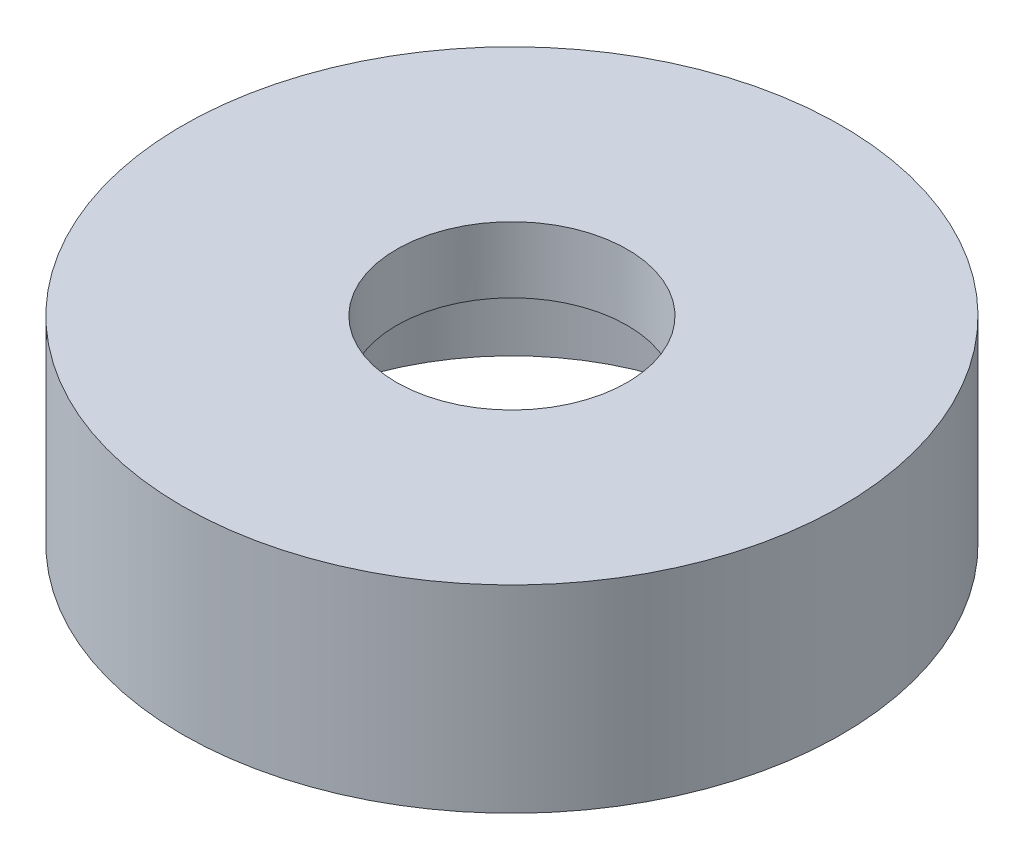
ISO-10303-21;
HEADER;
FILE_DESCRIPTION(('STEP AP214'),'2;1');
FILE_NAME('part.step','',(''),(''),'','','');
FILE_SCHEMA(('AUTOMOTIVE_DESIGN { 1 0 10303 214 1 1 1 1 }'));
ENDSEC;
DATA;
#1=APPLICATION_CONTEXT('core data for automotive mechanical design processes');
#2=APPLICATION_PROTOCOL_DEFINITION('international standard','automotive_design',2000,#1);
#3=PRODUCT_CONTEXT('',#1,'mechanical');
#4=PRODUCT('Part','Part','',(#3));
#5=PRODUCT_RELATED_PRODUCT_CATEGORY('part','',(#4));
#6=PRODUCT_DEFINITION_FORMATION('','',#4);
#7=PRODUCT_DEFINITION_CONTEXT('part definition',#1,'design');
#8=PRODUCT_DEFINITION('design','',#6,#7);
#9=PRODUCT_DEFINITION_SHAPE('','',#8);
#10=(LENGTH_UNIT() NAMED_UNIT(*) SI_UNIT(.MILLI.,.METRE.));
#11=(NAMED_UNIT(*) PLANE_ANGLE_UNIT() SI_UNIT($,.RADIAN.));
#12=(NAMED_UNIT(*) SI_UNIT($,.STERADIAN.) SOLID_ANGLE_UNIT());
#13=UNCERTAINTY_MEASURE_WITH_UNIT(LENGTH_MEASURE(1.E-05),#10,'distance_accuracy_value','');
#14=(GEOMETRIC_REPRESENTATION_CONTEXT(3) GLOBAL_UNCERTAINTY_ASSIGNED_CONTEXT((#13)) GLOBAL_UNIT_ASSIGNED_CONTEXT((#10,
#11,#12)) REPRESENTATION_CONTEXT('',''));
#15=CARTESIAN_POINT('',(0.,0.,0.));
#16=DIRECTION('',(0.,0.,1.));
#17=DIRECTION('',(1.,0.,0.));
#18=AXIS2_PLACEMENT_3D('',#15,#16,#17);
#19=CARTESIAN_POINT('',(0.,12.,0.));
#20=DIRECTION('',(0.,-1.,0.));
#21=DIRECTION('',(0.,0.,-1.));
#22=AXIS2_PLACEMENT_3D('',#19,#20,#21);
#23=CYLINDRICAL_SURFACE('',#22,20.);
#24=CARTESIAN_POINT('',(0.,12.,0.));
#25=DIRECTION('',(0.,1.,0.));
#26=DIRECTION('',(0.,0.,1.));
#27=AXIS2_PLACEMENT_3D('',#24,#25,#26);
#28=CIRCLE('',#27,20.);
#29=CARTESIAN_POINT('',(0.,12.,20.));
#30=VERTEX_POINT('',#29);
#31=EDGE_CURVE('E10',#30,#30,#28,.T.);
#32=ORIENTED_EDGE('',*,*,#31,.F.);
#33=EDGE_LOOP('',(#32));
#34=FACE_BOUND('',#33,.T.);
#35=CARTESIAN_POINT('',(0.,0.,0.));
#36=DIRECTION('',(0.,1.,0.));
#37=DIRECTION('',(0.,0.,1.));
#38=AXIS2_PLACEMENT_3D('',#35,#36,#37);
#39=CIRCLE('',#38,20.);
#40=CARTESIAN_POINT('',(0.,0.,20.));
#41=VERTEX_POINT('',#40);
#42=EDGE_CURVE('E36',#41,#41,#39,.T.);
#43=ORIENTED_EDGE('',*,*,#42,.T.);
#44=EDGE_LOOP('',(#43));
#45=FACE_BOUND('',#44,.T.);
#46=ADVANCED_FACE('F29',(#34,#45),#23,.T.);
#47=CARTESIAN_POINT('',(0.,12.,0.));
#48=DIRECTION('',(0.,1.,0.));
#49=DIRECTION('',(0.,0.,1.));
#50=AXIS2_PLACEMENT_3D('',#47,#48,#49);
#51=PLANE('',#50);
#52=CARTESIAN_POINT('',(0.,12.,0.));
#53=DIRECTION('',(0.,1.,0.));
#54=DIRECTION('',(0.,0.,1.));
#55=AXIS2_PLACEMENT_3D('',#52,#53,#54);
#56=CIRCLE('',#55,7.);
#57=CARTESIAN_POINT('',(0.,12.,7.));
#58=VERTEX_POINT('',#57);
#59=EDGE_CURVE('E48',#58,#58,#56,.T.);
#60=ORIENTED_EDGE('',*,*,#59,.F.);
#61=EDGE_LOOP('',(#60));
#62=FACE_BOUND('',#61,.T.);
#63=ORIENTED_EDGE('',*,*,#31,.T.);
#64=EDGE_LOOP('',(#63));
#65=FACE_BOUND('',#64,.T.);
#66=ADVANCED_FACE('F72',(#62,#65),#51,.T.);
#67=CARTESIAN_POINT('',(0.,0.,0.));
#68=DIRECTION('',(0.,1.,0.));
#69=DIRECTION('',(0.,0.,1.));
#70=AXIS2_PLACEMENT_3D('',#67,#68,#69);
#71=PLANE('',#70);
#72=CARTESIAN_POINT('',(0.,0.,0.));
#73=DIRECTION('',(0.,-1.,0.));
#74=DIRECTION('',(0.,0.,-1.));
#75=AXIS2_PLACEMENT_3D('',#72,#73,#74);
#76=CIRCLE('',#75,14.);
#77=CARTESIAN_POINT('',(0.,0.,-14.));
#78=VERTEX_POINT('',#77);
#79=EDGE_CURVE('E43',#78,#78,#76,.T.);
#80=ORIENTED_EDGE('',*,*,#79,.F.);
#81=EDGE_LOOP('',(#80));
#82=FACE_BOUND('',#81,.T.);
#83=ORIENTED_EDGE('',*,*,#42,.F.);
#84=EDGE_LOOP('',(#83));
#85=FACE_BOUND('',#84,.T.);
#86=ADVANCED_FACE('F66',(#82,#85),#71,.F.);
#87=CARTESIAN_POINT('',(0.,8.,0.));
#88=DIRECTION('',(0.,-1.,0.));
#89=DIRECTION('',(0.,0.,-1.));
#90=AXIS2_PLACEMENT_3D('',#87,#88,#89);
#91=CYLINDRICAL_SURFACE('',#90,14.);
#92=CARTESIAN_POINT('',(0.,8.,0.));
#93=DIRECTION('',(0.,-1.,0.));
#94=DIRECTION('',(0.,0.,-1.));
#95=AXIS2_PLACEMENT_3D('',#92,#93,#94);
#96=CIRCLE('',#95,14.);
#97=CARTESIAN_POINT('',(0.,8.,-14.));
#98=VERTEX_POINT('',#97);
#99=EDGE_CURVE('E41',#98,#98,#96,.T.);
#100=ORIENTED_EDGE('',*,*,#99,.F.);
#101=EDGE_LOOP('',(#100));
#102=FACE_BOUND('',#101,.T.);
#103=ORIENTED_EDGE('',*,*,#79,.T.);
#104=EDGE_LOOP('',(#103));
#105=FACE_BOUND('',#104,.T.);
#106=ADVANCED_FACE('F60',(#102,#105),#91,.F.);
#107=CARTESIAN_POINT('',(0.,8.,0.));
#108=DIRECTION('',(0.,-1.,0.));
#109=DIRECTION('',(0.,0.,-1.));
#110=AXIS2_PLACEMENT_3D('',#107,#108,#109);
#111=PLANE('',#110);
#112=CARTESIAN_POINT('',(0.,8.,0.));
#113=DIRECTION('',(0.,-1.,0.));
#114=DIRECTION('',(0.,0.,-1.));
#115=AXIS2_PLACEMENT_3D('',#112,#113,#114);
#116=CIRCLE('',#115,7.);
#117=CARTESIAN_POINT('',(0.,8.,-7.));
#118=VERTEX_POINT('',#117);
#119=EDGE_CURVE('E32',#118,#118,#116,.T.);
#120=ORIENTED_EDGE('',*,*,#119,.F.);
#121=EDGE_LOOP('',(#120));
#122=FACE_BOUND('',#121,.T.);
#123=ORIENTED_EDGE('',*,*,#99,.T.);
#124=EDGE_LOOP('',(#123));
#125=FACE_BOUND('',#124,.T.);
#126=ADVANCED_FACE('F57',(#122,#125),#111,.T.);
#127=CARTESIAN_POINT('',(0.,0.,0.));
#128=DIRECTION('',(0.,1.,0.));
#129=DIRECTION('',(0.,0.,1.));
#130=AXIS2_PLACEMENT_3D('',#127,#128,#129);
#131=CYLINDRICAL_SURFACE('',#130,7.);
#132=ORIENTED_EDGE('',*,*,#119,.T.);
#133=EDGE_LOOP('',(#132));
#134=FACE_BOUND('',#133,.T.);
#135=ORIENTED_EDGE('',*,*,#59,.T.);
#136=EDGE_LOOP('',(#135));
#137=FACE_BOUND('',#136,.T.);
#138=ADVANCED_FACE('F55',(#134,#137),#131,.F.);
#139=CLOSED_SHELL('',(#46,#66,#86,#106,#126,#138));
#140=MANIFOLD_SOLID_BREP('B2',#139);
#141=ADVANCED_BREP_SHAPE_REPRESENTATION('',(#18,#140),#14);
#142=SHAPE_DEFINITION_REPRESENTATION(#9,#141);
ENDSEC;
END-ISO-10303-21;
